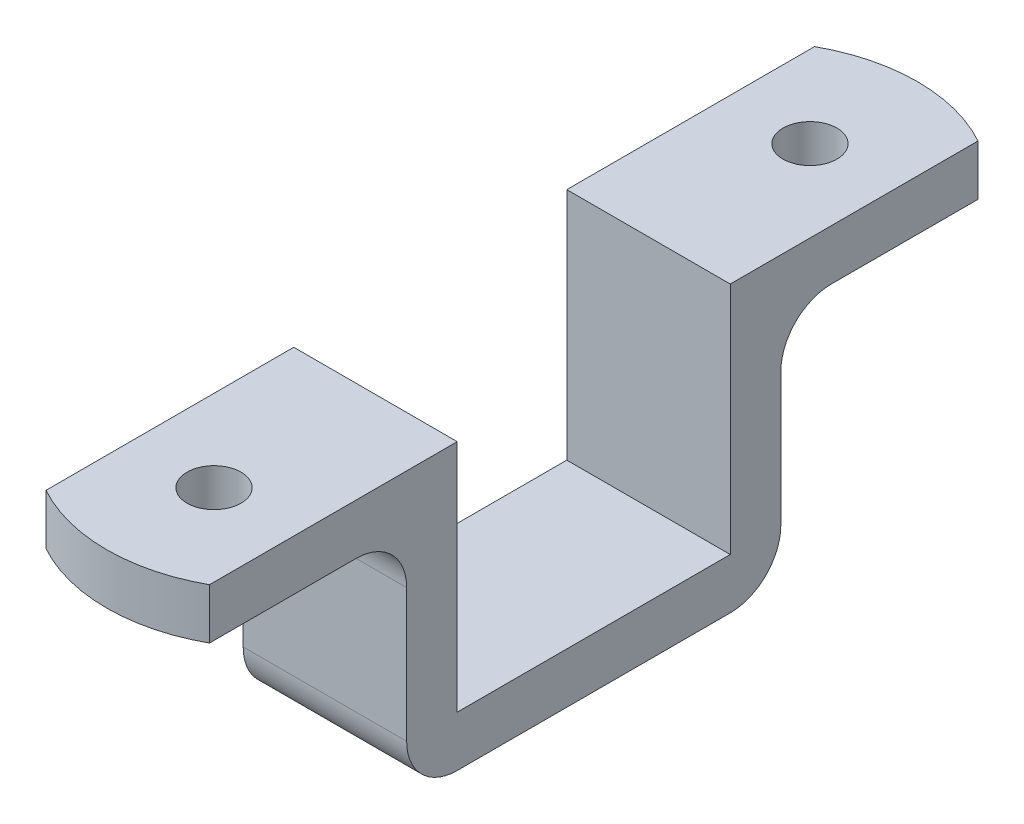
ISO-10303-21;
HEADER;
FILE_DESCRIPTION(('STEP AP214'),'2;1');
FILE_NAME('part.step','',(''),(''),'','','');
FILE_SCHEMA(('AUTOMOTIVE_DESIGN { 1 0 10303 214 1 1 1 1 }'));
ENDSEC;
DATA;
#1=APPLICATION_CONTEXT('core data for automotive mechanical design processes');
#2=APPLICATION_PROTOCOL_DEFINITION('international standard','automotive_design',2000,#1);
#3=PRODUCT_CONTEXT('',#1,'mechanical');
#4=PRODUCT('Part','Part','',(#3));
#5=PRODUCT_RELATED_PRODUCT_CATEGORY('part','',(#4));
#6=PRODUCT_DEFINITION_FORMATION('','',#4);
#7=PRODUCT_DEFINITION_CONTEXT('part definition',#1,'design');
#8=PRODUCT_DEFINITION('design','',#6,#7);
#9=PRODUCT_DEFINITION_SHAPE('','',#8);
#10=(LENGTH_UNIT() NAMED_UNIT(*) SI_UNIT(.MILLI.,.METRE.));
#11=(NAMED_UNIT(*) PLANE_ANGLE_UNIT() SI_UNIT($,.RADIAN.));
#12=(NAMED_UNIT(*) SI_UNIT($,.STERADIAN.) SOLID_ANGLE_UNIT());
#13=UNCERTAINTY_MEASURE_WITH_UNIT(LENGTH_MEASURE(1.E-05),#10,'distance_accuracy_value','');
#14=(GEOMETRIC_REPRESENTATION_CONTEXT(3) GLOBAL_UNCERTAINTY_ASSIGNED_CONTEXT((#13)) GLOBAL_UNIT_ASSIGNED_CONTEXT((#10,
#11,#12)) REPRESENTATION_CONTEXT('',''));
#15=CARTESIAN_POINT('',(0.,0.,0.));
#16=DIRECTION('',(0.,0.,1.));
#17=DIRECTION('',(1.,0.,0.));
#18=AXIS2_PLACEMENT_3D('',#15,#16,#17);
#19=CARTESIAN_POINT('',(9.7,0.,0.));
#20=DIRECTION('',(0.,-1.,0.));
#21=DIRECTION('',(0.,0.,-1.));
#22=AXIS2_PLACEMENT_3D('',#19,#20,#21);
#23=PLANE('',#22);
#24=CARTESIAN_POINT('',(4.85,0.,7.32));
#25=DIRECTION('',(0.,-1.,0.));
#26=DIRECTION('',(0.,0.,-1.));
#27=AXIS2_PLACEMENT_3D('',#24,#25,#26);
#28=CIRCLE('',#27,1.6);
#29=CARTESIAN_POINT('',(4.85,0.,5.72));
#30=VERTEX_POINT('',#29);
#31=EDGE_CURVE('E482',#30,#30,#28,.T.);
#32=ORIENTED_EDGE('',*,*,#31,.T.);
#33=EDGE_LOOP('',(#32));
#34=FACE_BOUND('',#33,.T.);
#35=DIRECTION('',(0.,0.,1.));
#36=VECTOR('',#35,1.);
#37=CARTESIAN_POINT('',(9.7,0.,0.));
#38=LINE('',#37,#36);
#39=CARTESIAN_POINT('',(9.7,0.,2.2));
#40=VERTEX_POINT('',#39);
#41=CARTESIAN_POINT('',(9.7,0.,16.9));
#42=VERTEX_POINT('',#41);
#43=EDGE_CURVE('E198',#40,#42,#38,.T.);
#44=ORIENTED_EDGE('',*,*,#43,.F.);
#45=CARTESIAN_POINT('',(4.85,0.,10.945141508289));
#46=DIRECTION('',(0.,-1.,0.));
#47=DIRECTION('',(0.,0.,-1.));
#48=AXIS2_PLACEMENT_3D('',#45,#46,#47);
#49=CIRCLE('',#48,10.);
#50=CARTESIAN_POINT('',(0.,0.,2.2));
#51=VERTEX_POINT('',#50);
#52=EDGE_CURVE('E145',#40,#51,#49,.F.);
#53=ORIENTED_EDGE('',*,*,#52,.T.);
#54=DIRECTION('',(0.,0.,1.));
#55=VECTOR('',#54,1.);
#56=CARTESIAN_POINT('',(0.,0.,0.));
#57=LINE('',#56,#55);
#58=CARTESIAN_POINT('',(0.,0.,16.9));
#59=VERTEX_POINT('',#58);
#60=EDGE_CURVE('E175',#51,#59,#57,.T.);
#61=ORIENTED_EDGE('',*,*,#60,.T.);
#62=DIRECTION('',(-1.,0.,0.));
#63=VECTOR('',#62,1.);
#64=CARTESIAN_POINT('',(9.7,0.,16.9));
#65=LINE('',#64,#63);
#66=EDGE_CURVE('E205',#42,#59,#65,.T.);
#67=ORIENTED_EDGE('',*,*,#66,.F.);
#68=EDGE_LOOP('',(#44,#53,#61,#67));
#69=FACE_BOUND('',#68,.T.);
#70=ADVANCED_FACE('F32',(#34,#69),#23,.F.);
#71=CARTESIAN_POINT('',(9.7,0.,16.9));
#72=DIRECTION('',(0.,0.,-1.));
#73=DIRECTION('',(-1.,0.,0.));
#74=AXIS2_PLACEMENT_3D('',#71,#72,#73);
#75=PLANE('',#74);
#76=DIRECTION('',(0.,-1.,0.));
#77=VECTOR('',#76,1.);
#78=CARTESIAN_POINT('',(0.,0.,16.9));
#79=LINE('',#78,#77);
#80=CARTESIAN_POINT('',(0.,-13.9,16.9));
#81=VERTEX_POINT('',#80);
#82=EDGE_CURVE('E177',#59,#81,#79,.T.);
#83=ORIENTED_EDGE('',*,*,#82,.T.);
#84=DIRECTION('',(-1.,0.,0.));
#85=VECTOR('',#84,1.);
#86=CARTESIAN_POINT('',(9.7,-13.9,16.9));
#87=LINE('',#86,#85);
#88=CARTESIAN_POINT('',(9.7,-13.9,16.9));
#89=VERTEX_POINT('',#88);
#90=EDGE_CURVE('E202',#89,#81,#87,.T.);
#91=ORIENTED_EDGE('',*,*,#90,.F.);
#92=DIRECTION('',(0.,-1.,0.));
#93=VECTOR('',#92,1.);
#94=CARTESIAN_POINT('',(9.7,0.,16.9));
#95=LINE('',#94,#93);
#96=EDGE_CURVE('E271',#42,#89,#95,.T.);
#97=ORIENTED_EDGE('',*,*,#96,.F.);
#98=ORIENTED_EDGE('',*,*,#66,.T.);
#99=EDGE_LOOP('',(#83,#91,#97,#98));
#100=FACE_BOUND('',#99,.T.);
#101=ADVANCED_FACE('F270',(#100),#75,.F.);
#102=CARTESIAN_POINT('',(9.7,-13.9,16.9));
#103=DIRECTION('',(0.,-1.,0.));
#104=DIRECTION('',(0.,0.,-1.));
#105=AXIS2_PLACEMENT_3D('',#102,#103,#104);
#106=PLANE('',#105);
#107=DIRECTION('',(0.,0.,1.));
#108=VECTOR('',#107,1.);
#109=CARTESIAN_POINT('',(0.,-13.9,16.9));
#110=LINE('',#109,#108);
#111=CARTESIAN_POINT('',(0.,-13.9,33.1));
#112=VERTEX_POINT('',#111);
#113=EDGE_CURVE('E180',#81,#112,#110,.T.);
#114=ORIENTED_EDGE('',*,*,#113,.T.);
#115=DIRECTION('',(-1.,0.,0.));
#116=VECTOR('',#115,1.);
#117=CARTESIAN_POINT('',(9.7,-13.9,33.1));
#118=LINE('',#117,#116);
#119=CARTESIAN_POINT('',(9.7,-13.9,33.1));
#120=VERTEX_POINT('',#119);
#121=EDGE_CURVE('E169',#120,#112,#118,.T.);
#122=ORIENTED_EDGE('',*,*,#121,.F.);
#123=DIRECTION('',(0.,0.,1.));
#124=VECTOR('',#123,1.);
#125=CARTESIAN_POINT('',(9.7,-13.9,16.9));
#126=LINE('',#125,#124);
#127=EDGE_CURVE('E267',#89,#120,#126,.T.);
#128=ORIENTED_EDGE('',*,*,#127,.F.);
#129=ORIENTED_EDGE('',*,*,#90,.T.);
#130=EDGE_LOOP('',(#114,#122,#128,#129));
#131=FACE_BOUND('',#130,.T.);
#132=ADVANCED_FACE('F264',(#131),#106,.F.);
#133=CARTESIAN_POINT('',(9.7,-13.9,33.1));
#134=DIRECTION('',(0.,0.,1.));
#135=DIRECTION('',(1.,0.,0.));
#136=AXIS2_PLACEMENT_3D('',#133,#134,#135);
#137=PLANE('',#136);
#138=DIRECTION('',(0.,1.,0.));
#139=VECTOR('',#138,1.);
#140=CARTESIAN_POINT('',(0.,-13.9,33.1));
#141=LINE('',#140,#139);
#142=CARTESIAN_POINT('',(0.,0.,33.1));
#143=VERTEX_POINT('',#142);
#144=EDGE_CURVE('E182',#112,#143,#141,.T.);
#145=ORIENTED_EDGE('',*,*,#144,.T.);
#146=DIRECTION('',(-1.,0.,0.));
#147=VECTOR('',#146,1.);
#148=CARTESIAN_POINT('',(9.7,0.,33.1));
#149=LINE('',#148,#147);
#150=CARTESIAN_POINT('',(9.7,0.,33.1));
#151=VERTEX_POINT('',#150);
#152=EDGE_CURVE('E165',#151,#143,#149,.T.);
#153=ORIENTED_EDGE('',*,*,#152,.F.);
#154=DIRECTION('',(0.,1.,0.));
#155=VECTOR('',#154,1.);
#156=CARTESIAN_POINT('',(9.7,-13.9,33.1));
#157=LINE('',#156,#155);
#158=EDGE_CURVE('E259',#120,#151,#157,.T.);
#159=ORIENTED_EDGE('',*,*,#158,.F.);
#160=ORIENTED_EDGE('',*,*,#121,.T.);
#161=EDGE_LOOP('',(#145,#153,#159,#160));
#162=FACE_BOUND('',#161,.T.);
#163=ADVANCED_FACE('F258',(#162),#137,.F.);
#164=CARTESIAN_POINT('',(9.7,0.,33.1));
#165=DIRECTION('',(0.,-1.,0.));
#166=DIRECTION('',(0.,0.,-1.));
#167=AXIS2_PLACEMENT_3D('',#164,#165,#166);
#168=PLANE('',#167);
#169=CARTESIAN_POINT('',(4.85,0.,42.68));
#170=DIRECTION('',(0.,-1.,0.));
#171=DIRECTION('',(0.,0.,-1.));
#172=AXIS2_PLACEMENT_3D('',#169,#170,#171);
#173=CIRCLE('',#172,1.6);
#174=CARTESIAN_POINT('',(4.85,0.,41.08));
#175=VERTEX_POINT('',#174);
#176=EDGE_CURVE('E178',#175,#175,#173,.T.);
#177=ORIENTED_EDGE('',*,*,#176,.T.);
#178=EDGE_LOOP('',(#177));
#179=FACE_BOUND('',#178,.T.);
#180=DIRECTION('',(0.,0.,1.));
#181=VECTOR('',#180,1.);
#182=CARTESIAN_POINT('',(0.,0.,33.1));
#183=LINE('',#182,#181);
#184=CARTESIAN_POINT('',(0.,0.,47.8));
#185=VERTEX_POINT('',#184);
#186=EDGE_CURVE('E184',#143,#185,#183,.T.);
#187=ORIENTED_EDGE('',*,*,#186,.T.);
#188=CARTESIAN_POINT('',(4.85,0.,39.054858491711));
#189=DIRECTION('',(0.,-1.,0.));
#190=DIRECTION('',(0.,0.,-1.));
#191=AXIS2_PLACEMENT_3D('',#188,#189,#190);
#192=CIRCLE('',#191,10.);
#193=CARTESIAN_POINT('',(9.7,0.,47.8));
#194=VERTEX_POINT('',#193);
#195=EDGE_CURVE('E54',#185,#194,#192,.F.);
#196=ORIENTED_EDGE('',*,*,#195,.T.);
#197=DIRECTION('',(0.,0.,1.));
#198=VECTOR('',#197,1.);
#199=CARTESIAN_POINT('',(9.7,0.,33.1));
#200=LINE('',#199,#198);
#201=EDGE_CURVE('E255',#151,#194,#200,.T.);
#202=ORIENTED_EDGE('',*,*,#201,.F.);
#203=ORIENTED_EDGE('',*,*,#152,.T.);
#204=EDGE_LOOP('',(#187,#196,#202,#203));
#205=FACE_BOUND('',#204,.T.);
#206=ADVANCED_FACE('F251',(#179,#205),#168,.F.);
#207=CARTESIAN_POINT('',(9.7,-3.,50.));
#208=DIRECTION('',(0.,1.,0.));
#209=DIRECTION('',(0.,0.,1.));
#210=AXIS2_PLACEMENT_3D('',#207,#208,#209);
#211=PLANE('',#210);
#212=CARTESIAN_POINT('',(4.85,-3.,42.68));
#213=DIRECTION('',(0.,-1.,0.));
#214=DIRECTION('',(0.,0.,-1.));
#215=AXIS2_PLACEMENT_3D('',#212,#213,#214);
#216=CIRCLE('',#215,1.6);
#217=CARTESIAN_POINT('',(4.85,-3.,41.08));
#218=VERTEX_POINT('',#217);
#219=EDGE_CURVE('E484',#218,#218,#216,.T.);
#220=ORIENTED_EDGE('',*,*,#219,.F.);
#221=EDGE_LOOP('',(#220));
#222=FACE_BOUND('',#221,.T.);
#223=DIRECTION('',(0.,0.,-1.));
#224=VECTOR('',#223,1.);
#225=CARTESIAN_POINT('',(9.7,-3.,50.));
#226=LINE('',#225,#224);
#227=CARTESIAN_POINT('',(9.7,-3.,47.8));
#228=VERTEX_POINT('',#227);
#229=CARTESIAN_POINT('',(9.7,-3.,39.1));
#230=VERTEX_POINT('',#229);
#231=EDGE_CURVE('E471',#228,#230,#226,.T.);
#232=ORIENTED_EDGE('',*,*,#231,.F.);
#233=CARTESIAN_POINT('',(4.85,-3.,39.054858491711));
#234=DIRECTION('',(0.,1.,0.));
#235=DIRECTION('',(0.,0.,1.));
#236=AXIS2_PLACEMENT_3D('',#233,#234,#235);
#237=CIRCLE('',#236,10.);
#238=CARTESIAN_POINT('',(0.,-3.,47.8));
#239=VERTEX_POINT('',#238);
#240=EDGE_CURVE('E494',#239,#228,#237,.T.);
#241=ORIENTED_EDGE('',*,*,#240,.F.);
#242=DIRECTION('',(0.,0.,-1.));
#243=VECTOR('',#242,1.);
#244=CARTESIAN_POINT('',(0.,-3.,50.));
#245=LINE('',#244,#243);
#246=CARTESIAN_POINT('',(0.,-3.,39.1));
#247=VERTEX_POINT('',#246);
#248=EDGE_CURVE('E187',#239,#247,#245,.T.);
#249=ORIENTED_EDGE('',*,*,#248,.T.);
#250=DIRECTION('',(-1.,0.,0.));
#251=VECTOR('',#250,1.);
#252=CARTESIAN_POINT('',(9.7,-3.,39.1));
#253=LINE('',#252,#251);
#254=EDGE_CURVE('E233',#247,#230,#253,.F.);
#255=ORIENTED_EDGE('',*,*,#254,.T.);
#256=EDGE_LOOP('',(#232,#241,#249,#255));
#257=FACE_BOUND('',#256,.T.);
#258=ADVANCED_FACE('F308',(#222,#257),#211,.F.);
#259=CARTESIAN_POINT('',(9.7,-3.,36.1));
#260=DIRECTION('',(0.,0.,-1.));
#261=DIRECTION('',(-1.,0.,0.));
#262=AXIS2_PLACEMENT_3D('',#259,#260,#261);
#263=PLANE('',#262);
#264=DIRECTION('',(0.,-1.,0.));
#265=VECTOR('',#264,1.);
#266=CARTESIAN_POINT('',(0.,-3.,36.1));
#267=LINE('',#266,#265);
#268=CARTESIAN_POINT('',(0.,-6.,36.1));
#269=VERTEX_POINT('',#268);
#270=CARTESIAN_POINT('',(0.,-13.9,36.1));
#271=VERTEX_POINT('',#270);
#272=EDGE_CURVE('E189',#269,#271,#267,.T.);
#273=ORIENTED_EDGE('',*,*,#272,.T.);
#274=DIRECTION('',(-1.,0.,0.));
#275=VECTOR('',#274,1.);
#276=CARTESIAN_POINT('',(9.7,-13.9,36.1));
#277=LINE('',#276,#275);
#278=CARTESIAN_POINT('',(9.7,-13.9,36.1));
#279=VERTEX_POINT('',#278);
#280=EDGE_CURVE('E231',#271,#279,#277,.F.);
#281=ORIENTED_EDGE('',*,*,#280,.T.);
#282=DIRECTION('',(0.,-1.,0.));
#283=VECTOR('',#282,1.);
#284=CARTESIAN_POINT('',(9.7,-3.,36.1));
#285=LINE('',#284,#283);
#286=CARTESIAN_POINT('',(9.7,-6.,36.1));
#287=VERTEX_POINT('',#286);
#288=EDGE_CURVE('E468',#287,#279,#285,.T.);
#289=ORIENTED_EDGE('',*,*,#288,.F.);
#290=DIRECTION('',(-1.,0.,0.));
#291=VECTOR('',#290,1.);
#292=CARTESIAN_POINT('',(0.,-6.,36.1));
#293=LINE('',#292,#291);
#294=EDGE_CURVE('E228',#287,#269,#293,.T.);
#295=ORIENTED_EDGE('',*,*,#294,.T.);
#296=EDGE_LOOP('',(#273,#281,#289,#295));
#297=FACE_BOUND('',#296,.T.);
#298=ADVANCED_FACE('F312',(#297),#263,.F.);
#299=CARTESIAN_POINT('',(9.7,-16.9,36.1));
#300=DIRECTION('',(0.,1.,0.));
#301=DIRECTION('',(0.,0.,1.));
#302=AXIS2_PLACEMENT_3D('',#299,#300,#301);
#303=PLANE('',#302);
#304=DIRECTION('',(0.,0.,-1.));
#305=VECTOR('',#304,1.);
#306=CARTESIAN_POINT('',(0.,-16.9,36.1));
#307=LINE('',#306,#305);
#308=CARTESIAN_POINT('',(0.,-16.9,33.1));
#309=VERTEX_POINT('',#308);
#310=CARTESIAN_POINT('',(0.,-16.9,16.9));
#311=VERTEX_POINT('',#310);
#312=EDGE_CURVE('E192',#309,#311,#307,.T.);
#313=ORIENTED_EDGE('',*,*,#312,.T.);
#314=DIRECTION('',(-1.,0.,0.));
#315=VECTOR('',#314,1.);
#316=CARTESIAN_POINT('',(9.7,-16.9,16.9));
#317=LINE('',#316,#315);
#318=CARTESIAN_POINT('',(9.7,-16.9,16.9));
#319=VERTEX_POINT('',#318);
#320=EDGE_CURVE('E222',#311,#319,#317,.F.);
#321=ORIENTED_EDGE('',*,*,#320,.T.);
#322=DIRECTION('',(0.,0.,-1.));
#323=VECTOR('',#322,1.);
#324=CARTESIAN_POINT('',(9.7,-16.9,36.1));
#325=LINE('',#324,#323);
#326=CARTESIAN_POINT('',(9.7,-16.9,33.1));
#327=VERTEX_POINT('',#326);
#328=EDGE_CURVE('E171',#327,#319,#325,.T.);
#329=ORIENTED_EDGE('',*,*,#328,.F.);
#330=DIRECTION('',(-1.,0.,0.));
#331=VECTOR('',#330,1.);
#332=CARTESIAN_POINT('',(9.7,-16.9,33.1));
#333=LINE('',#332,#331);
#334=EDGE_CURVE('E219',#327,#309,#333,.T.);
#335=ORIENTED_EDGE('',*,*,#334,.T.);
#336=EDGE_LOOP('',(#313,#321,#329,#335));
#337=FACE_BOUND('',#336,.T.);
#338=ADVANCED_FACE('F316',(#337),#303,.F.);
#339=CARTESIAN_POINT('',(9.7,-16.9,13.9));
#340=DIRECTION('',(0.,0.,1.));
#341=DIRECTION('',(1.,0.,0.));
#342=AXIS2_PLACEMENT_3D('',#339,#340,#341);
#343=PLANE('',#342);
#344=DIRECTION('',(0.,1.,0.));
#345=VECTOR('',#344,1.);
#346=CARTESIAN_POINT('',(0.,-16.9,13.9));
#347=LINE('',#346,#345);
#348=CARTESIAN_POINT('',(0.,-13.9,13.9));
#349=VERTEX_POINT('',#348);
#350=CARTESIAN_POINT('',(0.,-6.,13.9));
#351=VERTEX_POINT('',#350);
#352=EDGE_CURVE('E195',#349,#351,#347,.T.);
#353=ORIENTED_EDGE('',*,*,#352,.T.);
#354=DIRECTION('',(-1.,0.,0.));
#355=VECTOR('',#354,1.);
#356=CARTESIAN_POINT('',(9.7,-6.,13.9));
#357=LINE('',#356,#355);
#358=CARTESIAN_POINT('',(9.7,-6.,13.9));
#359=VERTEX_POINT('',#358);
#360=EDGE_CURVE('E213',#351,#359,#357,.F.);
#361=ORIENTED_EDGE('',*,*,#360,.T.);
#362=DIRECTION('',(0.,1.,0.));
#363=VECTOR('',#362,1.);
#364=CARTESIAN_POINT('',(9.7,-16.9,13.9));
#365=LINE('',#364,#363);
#366=CARTESIAN_POINT('',(9.7,-13.9,13.9));
#367=VERTEX_POINT('',#366);
#368=EDGE_CURVE('E166',#367,#359,#365,.T.);
#369=ORIENTED_EDGE('',*,*,#368,.F.);
#370=DIRECTION('',(-1.,0.,0.));
#371=VECTOR('',#370,1.);
#372=CARTESIAN_POINT('',(9.7,-13.9,13.9));
#373=LINE('',#372,#371);
#374=EDGE_CURVE('E210',#367,#349,#373,.T.);
#375=ORIENTED_EDGE('',*,*,#374,.T.);
#376=EDGE_LOOP('',(#353,#361,#369,#375));
#377=FACE_BOUND('',#376,.T.);
#378=ADVANCED_FACE('F278',(#377),#343,.F.);
#379=CARTESIAN_POINT('',(9.7,-3.,13.9));
#380=DIRECTION('',(0.,1.,0.));
#381=DIRECTION('',(0.,0.,1.));
#382=AXIS2_PLACEMENT_3D('',#379,#380,#381);
#383=PLANE('',#382);
#384=CARTESIAN_POINT('',(4.85,-3.,7.32));
#385=DIRECTION('',(0.,-1.,0.));
#386=DIRECTION('',(0.,0.,-1.));
#387=AXIS2_PLACEMENT_3D('',#384,#385,#386);
#388=CIRCLE('',#387,1.6);
#389=CARTESIAN_POINT('',(4.85,-3.,5.72));
#390=VERTEX_POINT('',#389);
#391=EDGE_CURVE('E485',#390,#390,#388,.T.);
#392=ORIENTED_EDGE('',*,*,#391,.F.);
#393=EDGE_LOOP('',(#392));
#394=FACE_BOUND('',#393,.T.);
#395=DIRECTION('',(0.,0.,-1.));
#396=VECTOR('',#395,1.);
#397=CARTESIAN_POINT('',(0.,-3.,13.9));
#398=LINE('',#397,#396);
#399=CARTESIAN_POINT('',(0.,-3.,10.9));
#400=VERTEX_POINT('',#399);
#401=CARTESIAN_POINT('',(0.,-3.,2.2));
#402=VERTEX_POINT('',#401);
#403=EDGE_CURVE('E158',#400,#402,#398,.T.);
#404=ORIENTED_EDGE('',*,*,#403,.T.);
#405=CARTESIAN_POINT('',(4.85,-3.,10.945141508289));
#406=DIRECTION('',(0.,1.,0.));
#407=DIRECTION('',(0.,0.,1.));
#408=AXIS2_PLACEMENT_3D('',#405,#406,#407);
#409=CIRCLE('',#408,10.);
#410=CARTESIAN_POINT('',(9.7,-3.,2.2));
#411=VERTEX_POINT('',#410);
#412=EDGE_CURVE('E47',#411,#402,#409,.T.);
#413=ORIENTED_EDGE('',*,*,#412,.F.);
#414=DIRECTION('',(0.,0.,-1.));
#415=VECTOR('',#414,1.);
#416=CARTESIAN_POINT('',(9.7,-3.,13.9));
#417=LINE('',#416,#415);
#418=CARTESIAN_POINT('',(9.7,-3.,10.9));
#419=VERTEX_POINT('',#418);
#420=EDGE_CURVE('E155',#419,#411,#417,.T.);
#421=ORIENTED_EDGE('',*,*,#420,.F.);
#422=DIRECTION('',(-1.,0.,0.));
#423=VECTOR('',#422,1.);
#424=CARTESIAN_POINT('',(0.,-3.,10.9));
#425=LINE('',#424,#423);
#426=EDGE_CURVE('E208',#419,#400,#425,.T.);
#427=ORIENTED_EDGE('',*,*,#426,.T.);
#428=EDGE_LOOP('',(#404,#413,#421,#427));
#429=FACE_BOUND('',#428,.T.);
#430=ADVANCED_FACE('F153',(#394,#429),#383,.F.);
#431=CARTESIAN_POINT('',(9.7,0.,0.));
#432=DIRECTION('',(1.,0.,0.));
#433=DIRECTION('',(0.,0.,-1.));
#434=AXIS2_PLACEMENT_3D('',#431,#432,#433);
#435=PLANE('',#434);
#436=DIRECTION('',(0.,-1.,0.));
#437=VECTOR('',#436,1.);
#438=CARTESIAN_POINT('',(9.7,6.7,2.2));
#439=LINE('',#438,#437);
#440=EDGE_CURVE('E142',#40,#411,#439,.T.);
#441=ORIENTED_EDGE('',*,*,#440,.F.);
#442=ORIENTED_EDGE('',*,*,#43,.T.);
#443=ORIENTED_EDGE('',*,*,#96,.T.);
#444=ORIENTED_EDGE('',*,*,#127,.T.);
#445=ORIENTED_EDGE('',*,*,#158,.T.);
#446=ORIENTED_EDGE('',*,*,#201,.T.);
#447=DIRECTION('',(0.,-1.,0.));
#448=VECTOR('',#447,1.);
#449=CARTESIAN_POINT('',(9.7,6.7,47.8));
#450=LINE('',#449,#448);
#451=EDGE_CURVE('E159',#194,#228,#450,.T.);
#452=ORIENTED_EDGE('',*,*,#451,.T.);
#453=ORIENTED_EDGE('',*,*,#231,.T.);
#454=CARTESIAN_POINT('',(9.7,-6.,39.1));
#455=DIRECTION('',(1.,0.,0.));
#456=DIRECTION('',(0.,0.,-1.));
#457=AXIS2_PLACEMENT_3D('',#454,#455,#456);
#458=CIRCLE('',#457,3.);
#459=EDGE_CURVE('E242',#230,#287,#458,.F.);
#460=ORIENTED_EDGE('',*,*,#459,.T.);
#461=ORIENTED_EDGE('',*,*,#288,.T.);
#462=CARTESIAN_POINT('',(9.7,-13.9,33.1));
#463=DIRECTION('',(1.,0.,0.));
#464=DIRECTION('',(0.,0.,-1.));
#465=AXIS2_PLACEMENT_3D('',#462,#463,#464);
#466=CIRCLE('',#465,3.);
#467=EDGE_CURVE('E224',#279,#327,#466,.T.);
#468=ORIENTED_EDGE('',*,*,#467,.T.);
#469=ORIENTED_EDGE('',*,*,#328,.T.);
#470=CARTESIAN_POINT('',(9.7,-13.9,16.9));
#471=DIRECTION('',(1.,0.,0.));
#472=DIRECTION('',(0.,0.,-1.));
#473=AXIS2_PLACEMENT_3D('',#470,#471,#472);
#474=CIRCLE('',#473,3.);
#475=EDGE_CURVE('E226',#319,#367,#474,.T.);
#476=ORIENTED_EDGE('',*,*,#475,.T.);
#477=ORIENTED_EDGE('',*,*,#368,.T.);
#478=CARTESIAN_POINT('',(9.7,-6.,10.9));
#479=DIRECTION('',(1.,0.,0.));
#480=DIRECTION('',(0.,0.,-1.));
#481=AXIS2_PLACEMENT_3D('',#478,#479,#480);
#482=CIRCLE('',#481,3.);
#483=EDGE_CURVE('E164',#359,#419,#482,.F.);
#484=ORIENTED_EDGE('',*,*,#483,.T.);
#485=ORIENTED_EDGE('',*,*,#420,.T.);
#486=EDGE_LOOP('',(#441,#442,#443,#444,#445,#446,#452,#453,#460,#461,#468,#469,#476,#477,#484,#485));
#487=FACE_BOUND('',#486,.T.);
#488=ADVANCED_FACE('F161',(#487),#435,.T.);
#489=CARTESIAN_POINT('',(0.,0.,0.));
#490=DIRECTION('',(1.,0.,0.));
#491=DIRECTION('',(0.,0.,-1.));
#492=AXIS2_PLACEMENT_3D('',#489,#490,#491);
#493=PLANE('',#492);
#494=ORIENTED_EDGE('',*,*,#60,.F.);
#495=DIRECTION('',(0.,-1.,0.));
#496=VECTOR('',#495,1.);
#497=CARTESIAN_POINT('',(0.,6.7,2.2));
#498=LINE('',#497,#496);
#499=EDGE_CURVE('E11',#51,#402,#498,.T.);
#500=ORIENTED_EDGE('',*,*,#499,.T.);
#501=ORIENTED_EDGE('',*,*,#403,.F.);
#502=CARTESIAN_POINT('',(0.,-6.,10.9));
#503=DIRECTION('',(1.,0.,0.));
#504=DIRECTION('',(0.,0.,-1.));
#505=AXIS2_PLACEMENT_3D('',#502,#503,#504);
#506=CIRCLE('',#505,3.);
#507=EDGE_CURVE('E236',#400,#351,#506,.T.);
#508=ORIENTED_EDGE('',*,*,#507,.T.);
#509=ORIENTED_EDGE('',*,*,#352,.F.);
#510=CARTESIAN_POINT('',(0.,-13.9,16.9));
#511=DIRECTION('',(1.,0.,0.));
#512=DIRECTION('',(0.,0.,-1.));
#513=AXIS2_PLACEMENT_3D('',#510,#511,#512);
#514=CIRCLE('',#513,3.);
#515=EDGE_CURVE('E217',#349,#311,#514,.F.);
#516=ORIENTED_EDGE('',*,*,#515,.T.);
#517=ORIENTED_EDGE('',*,*,#312,.F.);
#518=CARTESIAN_POINT('',(0.,-13.9,33.1));
#519=DIRECTION('',(1.,0.,0.));
#520=DIRECTION('',(0.,0.,-1.));
#521=AXIS2_PLACEMENT_3D('',#518,#519,#520);
#522=CIRCLE('',#521,3.);
#523=EDGE_CURVE('E215',#309,#271,#522,.F.);
#524=ORIENTED_EDGE('',*,*,#523,.T.);
#525=ORIENTED_EDGE('',*,*,#272,.F.);
#526=CARTESIAN_POINT('',(0.,-6.,39.1));
#527=DIRECTION('',(1.,0.,0.));
#528=DIRECTION('',(0.,0.,-1.));
#529=AXIS2_PLACEMENT_3D('',#526,#527,#528);
#530=CIRCLE('',#529,3.);
#531=EDGE_CURVE('E239',#269,#247,#530,.T.);
#532=ORIENTED_EDGE('',*,*,#531,.T.);
#533=ORIENTED_EDGE('',*,*,#248,.F.);
#534=DIRECTION('',(0.,-1.,0.));
#535=VECTOR('',#534,1.);
#536=CARTESIAN_POINT('',(0.,6.7,47.8));
#537=LINE('',#536,#535);
#538=EDGE_CURVE('E40',#239,#185,#537,.F.);
#539=ORIENTED_EDGE('',*,*,#538,.T.);
#540=ORIENTED_EDGE('',*,*,#186,.F.);
#541=ORIENTED_EDGE('',*,*,#144,.F.);
#542=ORIENTED_EDGE('',*,*,#113,.F.);
#543=ORIENTED_EDGE('',*,*,#82,.F.);
#544=EDGE_LOOP('',(#494,#500,#501,#508,#509,#516,#517,#524,#525,#532,#533,#539,#540,#541,#542,#543));
#545=FACE_BOUND('',#544,.T.);
#546=ADVANCED_FACE('F247',(#545),#493,.F.);
#547=CARTESIAN_POINT('',(9.7,-6.,10.9));
#548=DIRECTION('',(1.,0.,0.));
#549=DIRECTION('',(0.,0.,-1.));
#550=AXIS2_PLACEMENT_3D('',#547,#548,#549);
#551=CYLINDRICAL_SURFACE('',#550,3.);
#552=ORIENTED_EDGE('',*,*,#483,.F.);
#553=ORIENTED_EDGE('',*,*,#360,.F.);
#554=ORIENTED_EDGE('',*,*,#507,.F.);
#555=ORIENTED_EDGE('',*,*,#426,.F.);
#556=EDGE_LOOP('',(#552,#553,#554,#555));
#557=FACE_BOUND('',#556,.T.);
#558=ADVANCED_FACE('F281',(#557),#551,.F.);
#559=CARTESIAN_POINT('',(9.7,-13.9,16.9));
#560=DIRECTION('',(-1.,0.,0.));
#561=DIRECTION('',(0.,0.,1.));
#562=AXIS2_PLACEMENT_3D('',#559,#560,#561);
#563=CYLINDRICAL_SURFACE('',#562,3.);
#564=ORIENTED_EDGE('',*,*,#475,.F.);
#565=ORIENTED_EDGE('',*,*,#320,.F.);
#566=ORIENTED_EDGE('',*,*,#515,.F.);
#567=ORIENTED_EDGE('',*,*,#374,.F.);
#568=EDGE_LOOP('',(#564,#565,#566,#567));
#569=FACE_BOUND('',#568,.T.);
#570=ADVANCED_FACE('F283',(#569),#563,.T.);
#571=CARTESIAN_POINT('',(9.7,-13.9,33.1));
#572=DIRECTION('',(-1.,0.,0.));
#573=DIRECTION('',(0.,0.,1.));
#574=AXIS2_PLACEMENT_3D('',#571,#572,#573);
#575=CYLINDRICAL_SURFACE('',#574,3.);
#576=ORIENTED_EDGE('',*,*,#467,.F.);
#577=ORIENTED_EDGE('',*,*,#280,.F.);
#578=ORIENTED_EDGE('',*,*,#523,.F.);
#579=ORIENTED_EDGE('',*,*,#334,.F.);
#580=EDGE_LOOP('',(#576,#577,#578,#579));
#581=FACE_BOUND('',#580,.T.);
#582=ADVANCED_FACE('F289',(#581),#575,.T.);
#583=CARTESIAN_POINT('',(9.7,-6.,39.1));
#584=DIRECTION('',(1.,0.,0.));
#585=DIRECTION('',(0.,0.,-1.));
#586=AXIS2_PLACEMENT_3D('',#583,#584,#585);
#587=CYLINDRICAL_SURFACE('',#586,3.);
#588=ORIENTED_EDGE('',*,*,#459,.F.);
#589=ORIENTED_EDGE('',*,*,#254,.F.);
#590=ORIENTED_EDGE('',*,*,#531,.F.);
#591=ORIENTED_EDGE('',*,*,#294,.F.);
#592=EDGE_LOOP('',(#588,#589,#590,#591));
#593=FACE_BOUND('',#592,.T.);
#594=ADVANCED_FACE('F34',(#593),#587,.F.);
#595=CARTESIAN_POINT('',(4.85,6.7,7.32));
#596=DIRECTION('',(0.,-1.,0.));
#597=DIRECTION('',(0.,0.,-1.));
#598=AXIS2_PLACEMENT_3D('',#595,#596,#597);
#599=CYLINDRICAL_SURFACE('',#598,1.6);
#600=ORIENTED_EDGE('',*,*,#391,.T.);
#601=EDGE_LOOP('',(#600));
#602=FACE_BOUND('',#601,.T.);
#603=ORIENTED_EDGE('',*,*,#31,.F.);
#604=EDGE_LOOP('',(#603));
#605=FACE_BOUND('',#604,.T.);
#606=ADVANCED_FACE('F328',(#602,#605),#599,.F.);
#607=CARTESIAN_POINT('',(4.85,6.7,42.68));
#608=DIRECTION('',(0.,-1.,0.));
#609=DIRECTION('',(0.,0.,-1.));
#610=AXIS2_PLACEMENT_3D('',#607,#608,#609);
#611=CYLINDRICAL_SURFACE('',#610,1.6);
#612=ORIENTED_EDGE('',*,*,#219,.T.);
#613=EDGE_LOOP('',(#612));
#614=FACE_BOUND('',#613,.T.);
#615=ORIENTED_EDGE('',*,*,#176,.F.);
#616=EDGE_LOOP('',(#615));
#617=FACE_BOUND('',#616,.T.);
#618=ADVANCED_FACE('F331',(#614,#617),#611,.F.);
#619=CARTESIAN_POINT('',(4.85,6.7,39.054858491711));
#620=DIRECTION('',(0.,-1.,0.));
#621=DIRECTION('',(0.,0.,-1.));
#622=AXIS2_PLACEMENT_3D('',#619,#620,#621);
#623=CYLINDRICAL_SURFACE('',#622,10.);
#624=ORIENTED_EDGE('',*,*,#538,.F.);
#625=ORIENTED_EDGE('',*,*,#240,.T.);
#626=ORIENTED_EDGE('',*,*,#451,.F.);
#627=ORIENTED_EDGE('',*,*,#195,.F.);
#628=EDGE_LOOP('',(#624,#625,#626,#627));
#629=FACE_BOUND('',#628,.T.);
#630=ADVANCED_FACE('F335',(#629),#623,.T.);
#631=CARTESIAN_POINT('',(4.85,6.7,10.945141508289));
#632=DIRECTION('',(0.,-1.,0.));
#633=DIRECTION('',(0.,0.,-1.));
#634=AXIS2_PLACEMENT_3D('',#631,#632,#633);
#635=CYLINDRICAL_SURFACE('',#634,10.);
#636=ORIENTED_EDGE('',*,*,#440,.T.);
#637=ORIENTED_EDGE('',*,*,#412,.T.);
#638=ORIENTED_EDGE('',*,*,#499,.F.);
#639=ORIENTED_EDGE('',*,*,#52,.F.);
#640=EDGE_LOOP('',(#636,#637,#638,#639));
#641=FACE_BOUND('',#640,.T.);
#642=ADVANCED_FACE('F143',(#641),#635,.T.);
#643=CLOSED_SHELL('',(#70,#101,#132,#163,#206,#258,#298,#338,#378,#430,#488,#546,#558,#570,#582,
#594,#606,#618,#630,#642));
#644=MANIFOLD_SOLID_BREP('B2',#643);
#645=ADVANCED_BREP_SHAPE_REPRESENTATION('',(#18,#644),#14);
#646=SHAPE_DEFINITION_REPRESENTATION(#9,#645);
ENDSEC;
END-ISO-10303-21;
